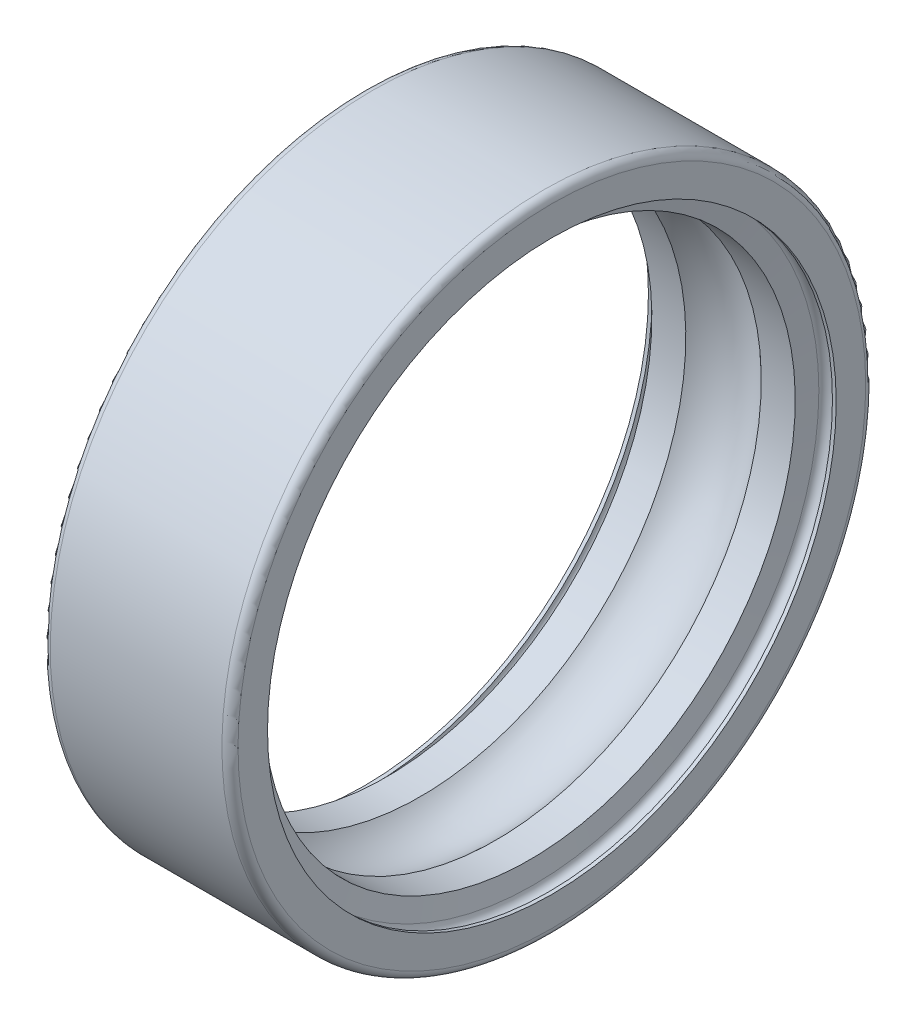
ISO-10303-21;
HEADER;
FILE_DESCRIPTION(('STEP AP214'),'2;1');
FILE_NAME('part.step','',(''),(''),'','','');
FILE_SCHEMA(('AUTOMOTIVE_DESIGN { 1 0 10303 214 1 1 1 1 }'));
ENDSEC;
DATA;
#1=APPLICATION_CONTEXT('core data for automotive mechanical design processes');
#2=APPLICATION_PROTOCOL_DEFINITION('international standard','automotive_design',2000,#1);
#3=PRODUCT_CONTEXT('',#1,'mechanical');
#4=PRODUCT('Part','Part','',(#3));
#5=PRODUCT_RELATED_PRODUCT_CATEGORY('part','',(#4));
#6=PRODUCT_DEFINITION_FORMATION('','',#4);
#7=PRODUCT_DEFINITION_CONTEXT('part definition',#1,'design');
#8=PRODUCT_DEFINITION('design','',#6,#7);
#9=PRODUCT_DEFINITION_SHAPE('','',#8);
#10=(LENGTH_UNIT() NAMED_UNIT(*) SI_UNIT(.MILLI.,.METRE.));
#11=(NAMED_UNIT(*) PLANE_ANGLE_UNIT() SI_UNIT($,.RADIAN.));
#12=(NAMED_UNIT(*) SI_UNIT($,.STERADIAN.) SOLID_ANGLE_UNIT());
#13=UNCERTAINTY_MEASURE_WITH_UNIT(LENGTH_MEASURE(1.E-05),#10,'distance_accuracy_value','');
#14=(GEOMETRIC_REPRESENTATION_CONTEXT(3) GLOBAL_UNCERTAINTY_ASSIGNED_CONTEXT((#13)) GLOBAL_UNIT_ASSIGNED_CONTEXT((#10,
#11,#12)) REPRESENTATION_CONTEXT('',''));
#15=CARTESIAN_POINT('',(0.,0.,0.));
#16=DIRECTION('',(0.,0.,1.));
#17=DIRECTION('',(1.,0.,0.));
#18=AXIS2_PLACEMENT_3D('',#15,#16,#17);
#19=CARTESIAN_POINT('',(6.58,0.,0.));
#20=DIRECTION('',(1.,0.,0.));
#21=DIRECTION('',(0.,0.,-1.));
#22=AXIS2_PLACEMENT_3D('',#19,#20,#21);
#23=TOROIDAL_SURFACE('',#22,10.6,0.28);
#24=CARTESIAN_POINT('',(6.86,0.,0.));
#25=DIRECTION('',(1.,0.,0.));
#26=DIRECTION('',(0.,1.,0.));
#27=AXIS2_PLACEMENT_3D('',#24,#25,#26);
#28=CIRCLE('',#27,10.6);
#29=CARTESIAN_POINT('',(6.86,10.6,0.));
#30=VERTEX_POINT('',#29);
#31=EDGE_CURVE('E11',#30,#30,#28,.T.);
#32=ORIENTED_EDGE('',*,*,#31,.T.);
#33=EDGE_LOOP('',(#32));
#34=FACE_BOUND('',#33,.T.);
#35=CARTESIAN_POINT('',(6.30425382915658,0.,0.));
#36=DIRECTION('',(1.,0.,0.));
#37=DIRECTION('',(0.,1.,0.));
#38=AXIS2_PLACEMENT_3D('',#35,#36,#37);
#39=CIRCLE('',#38,10.6486214897467);
#40=CARTESIAN_POINT('',(6.30425382915658,10.6486214897467,0.));
#41=VERTEX_POINT('',#40);
#42=EDGE_CURVE('E83',#41,#41,#39,.T.);
#43=ORIENTED_EDGE('',*,*,#42,.F.);
#44=EDGE_LOOP('',(#43));
#45=FACE_BOUND('',#44,.T.);
#46=ADVANCED_FACE('F16',(#34,#45),#23,.F.);
#47=CARTESIAN_POINT('',(6.93,0.,0.));
#48=DIRECTION('',(-1.,0.,0.));
#49=DIRECTION('',(0.,1.,0.));
#50=AXIS2_PLACEMENT_3D('',#47,#48,#49);
#51=CYLINDRICAL_SURFACE('',#50,10.6);
#52=CARTESIAN_POINT('',(7.,0.,0.));
#53=DIRECTION('',(1.,0.,0.));
#54=DIRECTION('',(0.,1.,0.));
#55=AXIS2_PLACEMENT_3D('',#52,#53,#54);
#56=CIRCLE('',#55,10.6);
#57=CARTESIAN_POINT('',(7.,10.6,0.));
#58=VERTEX_POINT('',#57);
#59=EDGE_CURVE('E26',#58,#58,#56,.T.);
#60=ORIENTED_EDGE('',*,*,#59,.T.);
#61=EDGE_LOOP('',(#60));
#62=FACE_BOUND('',#61,.T.);
#63=ORIENTED_EDGE('',*,*,#31,.F.);
#64=EDGE_LOOP('',(#63));
#65=FACE_BOUND('',#64,.T.);
#66=ADVANCED_FACE('F122',(#62,#65),#51,.F.);
#67=CARTESIAN_POINT('',(7.,11.15,0.));
#68=DIRECTION('',(1.,0.,0.));
#69=DIRECTION('',(0.,1.,0.));
#70=AXIS2_PLACEMENT_3D('',#67,#68,#69);
#71=PLANE('',#70);
#72=CARTESIAN_POINT('',(7.,0.,0.));
#73=DIRECTION('',(1.,0.,0.));
#74=DIRECTION('',(0.,1.,0.));
#75=AXIS2_PLACEMENT_3D('',#72,#73,#74);
#76=CIRCLE('',#75,11.7);
#77=CARTESIAN_POINT('',(7.,11.7,0.));
#78=VERTEX_POINT('',#77);
#79=EDGE_CURVE('E88',#78,#78,#76,.T.);
#80=ORIENTED_EDGE('',*,*,#79,.T.);
#81=EDGE_LOOP('',(#80));
#82=FACE_BOUND('',#81,.T.);
#83=ORIENTED_EDGE('',*,*,#59,.F.);
#84=EDGE_LOOP('',(#83));
#85=FACE_BOUND('',#84,.T.);
#86=ADVANCED_FACE('F126',(#82,#85),#71,.T.);
#87=CARTESIAN_POINT('',(6.7,0.,0.));
#88=DIRECTION('',(1.,0.,0.));
#89=DIRECTION('',(0.,0.,-1.));
#90=AXIS2_PLACEMENT_3D('',#87,#88,#89);
#91=TOROIDAL_SURFACE('',#90,11.7,0.3);
#92=CARTESIAN_POINT('',(6.7,0.,0.));
#93=DIRECTION('',(1.,0.,0.));
#94=DIRECTION('',(0.,1.,0.));
#95=AXIS2_PLACEMENT_3D('',#92,#93,#94);
#96=CIRCLE('',#95,12.);
#97=CARTESIAN_POINT('',(6.7,12.,0.));
#98=VERTEX_POINT('',#97);
#99=EDGE_CURVE('E86',#98,#98,#96,.T.);
#100=ORIENTED_EDGE('',*,*,#99,.T.);
#101=EDGE_LOOP('',(#100));
#102=FACE_BOUND('',#101,.T.);
#103=ORIENTED_EDGE('',*,*,#79,.F.);
#104=EDGE_LOOP('',(#103));
#105=FACE_BOUND('',#104,.T.);
#106=ADVANCED_FACE('F130',(#102,#105),#91,.T.);
#107=CARTESIAN_POINT('',(3.5,0.,0.));
#108=DIRECTION('',(-1.,0.,0.));
#109=DIRECTION('',(0.,1.,0.));
#110=AXIS2_PLACEMENT_3D('',#107,#108,#109);
#111=CYLINDRICAL_SURFACE('',#110,12.);
#112=CARTESIAN_POINT('',(0.3,0.,0.));
#113=DIRECTION('',(1.,0.,0.));
#114=DIRECTION('',(0.,1.,0.));
#115=AXIS2_PLACEMENT_3D('',#112,#113,#114);
#116=CIRCLE('',#115,12.);
#117=CARTESIAN_POINT('',(0.3,12.,0.));
#118=VERTEX_POINT('',#117);
#119=EDGE_CURVE('E84',#118,#118,#116,.T.);
#120=ORIENTED_EDGE('',*,*,#119,.T.);
#121=EDGE_LOOP('',(#120));
#122=FACE_BOUND('',#121,.T.);
#123=ORIENTED_EDGE('',*,*,#99,.F.);
#124=EDGE_LOOP('',(#123));
#125=FACE_BOUND('',#124,.T.);
#126=ADVANCED_FACE('F132',(#122,#125),#111,.T.);
#127=CARTESIAN_POINT('',(0.3,0.,0.));
#128=DIRECTION('',(1.,0.,0.));
#129=DIRECTION('',(0.,0.,-1.));
#130=AXIS2_PLACEMENT_3D('',#127,#128,#129);
#131=TOROIDAL_SURFACE('',#130,11.7,0.3);
#132=CARTESIAN_POINT('',(0.,0.,0.));
#133=DIRECTION('',(1.,0.,0.));
#134=DIRECTION('',(0.,1.,0.));
#135=AXIS2_PLACEMENT_3D('',#132,#133,#134);
#136=CIRCLE('',#135,11.7);
#137=CARTESIAN_POINT('',(0.,11.7,0.));
#138=VERTEX_POINT('',#137);
#139=EDGE_CURVE('E87',#138,#138,#136,.T.);
#140=ORIENTED_EDGE('',*,*,#139,.T.);
#141=EDGE_LOOP('',(#140));
#142=FACE_BOUND('',#141,.T.);
#143=ORIENTED_EDGE('',*,*,#119,.F.);
#144=EDGE_LOOP('',(#143));
#145=FACE_BOUND('',#144,.T.);
#146=ADVANCED_FACE('F157',(#142,#145),#131,.T.);
#147=CARTESIAN_POINT('',(0.,11.15,0.));
#148=DIRECTION('',(-1.,0.,0.));
#149=DIRECTION('',(0.,-1.,0.));
#150=AXIS2_PLACEMENT_3D('',#147,#148,#149);
#151=PLANE('',#150);
#152=CARTESIAN_POINT('',(0.,0.,0.));
#153=DIRECTION('',(1.,0.,0.));
#154=DIRECTION('',(0.,1.,0.));
#155=AXIS2_PLACEMENT_3D('',#152,#153,#154);
#156=CIRCLE('',#155,10.6);
#157=CARTESIAN_POINT('',(0.,10.6,0.));
#158=VERTEX_POINT('',#157);
#159=EDGE_CURVE('E89',#158,#158,#156,.T.);
#160=ORIENTED_EDGE('',*,*,#159,.T.);
#161=EDGE_LOOP('',(#160));
#162=FACE_BOUND('',#161,.T.);
#163=ORIENTED_EDGE('',*,*,#139,.F.);
#164=EDGE_LOOP('',(#163));
#165=FACE_BOUND('',#164,.T.);
#166=ADVANCED_FACE('F149',(#162,#165),#151,.T.);
#167=CARTESIAN_POINT('',(0.07,0.,0.));
#168=DIRECTION('',(-1.,0.,0.));
#169=DIRECTION('',(0.,1.,0.));
#170=AXIS2_PLACEMENT_3D('',#167,#168,#169);
#171=CYLINDRICAL_SURFACE('',#170,10.6);
#172=CARTESIAN_POINT('',(0.14,0.,0.));
#173=DIRECTION('',(1.,0.,0.));
#174=DIRECTION('',(0.,1.,0.));
#175=AXIS2_PLACEMENT_3D('',#172,#173,#174);
#176=CIRCLE('',#175,10.6);
#177=CARTESIAN_POINT('',(0.14,10.6,0.));
#178=VERTEX_POINT('',#177);
#179=EDGE_CURVE('E75',#178,#178,#176,.T.);
#180=ORIENTED_EDGE('',*,*,#179,.T.);
#181=EDGE_LOOP('',(#180));
#182=FACE_BOUND('',#181,.T.);
#183=ORIENTED_EDGE('',*,*,#159,.F.);
#184=EDGE_LOOP('',(#183));
#185=FACE_BOUND('',#184,.T.);
#186=ADVANCED_FACE('F144',(#182,#185),#171,.F.);
#187=CARTESIAN_POINT('',(0.42,0.,0.));
#188=DIRECTION('',(1.,0.,0.));
#189=DIRECTION('',(0.,0.,-1.));
#190=AXIS2_PLACEMENT_3D('',#187,#188,#189);
#191=TOROIDAL_SURFACE('',#190,10.6,0.28);
#192=CARTESIAN_POINT('',(0.695746170843417,0.,0.));
#193=DIRECTION('',(1.,0.,0.));
#194=DIRECTION('',(0.,1.,0.));
#195=AXIS2_PLACEMENT_3D('',#192,#193,#194);
#196=CIRCLE('',#195,10.6486214897467);
#197=CARTESIAN_POINT('',(0.695746170843417,10.6486214897467,0.));
#198=VERTEX_POINT('',#197);
#199=EDGE_CURVE('E66',#198,#198,#196,.T.);
#200=ORIENTED_EDGE('',*,*,#199,.T.);
#201=EDGE_LOOP('',(#200));
#202=FACE_BOUND('',#201,.T.);
#203=ORIENTED_EDGE('',*,*,#179,.F.);
#204=EDGE_LOOP('',(#203));
#205=FACE_BOUND('',#204,.T.);
#206=ADVANCED_FACE('F139',(#202,#205),#191,.F.);
#207=CARTESIAN_POINT('',(0.761747254333675,0.,0.));
#208=DIRECTION('',(-1.,0.,0.));
#209=DIRECTION('',(0.,1.,0.));
#210=AXIS2_PLACEMENT_3D('',#207,#208,#209);
#211=CONICAL_SURFACE('',#210,10.2743107448734,1.39626340159546);
#212=CARTESIAN_POINT('',(0.827748337823933,0.,0.));
#213=DIRECTION('',(1.,0.,0.));
#214=DIRECTION('',(0.,1.,0.));
#215=AXIS2_PLACEMENT_3D('',#212,#213,#214);
#216=CIRCLE('',#215,9.9);
#217=CARTESIAN_POINT('',(0.827748337823933,9.9,0.));
#218=VERTEX_POINT('',#217);
#219=EDGE_CURVE('E71',#218,#218,#216,.T.);
#220=ORIENTED_EDGE('',*,*,#219,.T.);
#221=EDGE_LOOP('',(#220));
#222=FACE_BOUND('',#221,.T.);
#223=ORIENTED_EDGE('',*,*,#199,.F.);
#224=EDGE_LOOP('',(#223));
#225=FACE_BOUND('',#224,.T.);
#226=ADVANCED_FACE('F18',(#222,#225),#211,.F.);
#227=CARTESIAN_POINT('',(1.46062452440441,0.,0.));
#228=DIRECTION('',(-1.,0.,0.));
#229=DIRECTION('',(0.,1.,0.));
#230=AXIS2_PLACEMENT_3D('',#227,#228,#229);
#231=CYLINDRICAL_SURFACE('',#230,9.9);
#232=CARTESIAN_POINT('',(2.0935007109849,0.,0.));
#233=DIRECTION('',(1.,0.,0.));
#234=DIRECTION('',(0.,1.,0.));
#235=AXIS2_PLACEMENT_3D('',#232,#233,#234);
#236=CIRCLE('',#235,9.9);
#237=CARTESIAN_POINT('',(2.0935007109849,9.9,0.));
#238=VERTEX_POINT('',#237);
#239=EDGE_CURVE('E20',#238,#238,#236,.T.);
#240=ORIENTED_EDGE('',*,*,#239,.T.);
#241=EDGE_LOOP('',(#240));
#242=FACE_BOUND('',#241,.T.);
#243=ORIENTED_EDGE('',*,*,#219,.F.);
#244=EDGE_LOOP('',(#243));
#245=FACE_BOUND('',#244,.T.);
#246=ADVANCED_FACE('F117',(#242,#245),#231,.F.);
#247=CARTESIAN_POINT('',(3.5,0.,0.));
#248=DIRECTION('',(1.,0.,0.));
#249=DIRECTION('',(0.,0.,-1.));
#250=AXIS2_PLACEMENT_3D('',#247,#248,#249);
#251=TOROIDAL_SURFACE('',#250,8.5,1.9845);
#252=CARTESIAN_POINT('',(4.9064992890151,0.,0.));
#253=DIRECTION('',(1.,0.,0.));
#254=DIRECTION('',(0.,1.,0.));
#255=AXIS2_PLACEMENT_3D('',#252,#253,#254);
#256=CIRCLE('',#255,9.9);
#257=CARTESIAN_POINT('',(4.9064992890151,9.9,0.));
#258=VERTEX_POINT('',#257);
#259=EDGE_CURVE('E77',#258,#258,#256,.T.);
#260=ORIENTED_EDGE('',*,*,#259,.T.);
#261=EDGE_LOOP('',(#260));
#262=FACE_BOUND('',#261,.T.);
#263=ORIENTED_EDGE('',*,*,#239,.F.);
#264=EDGE_LOOP('',(#263));
#265=FACE_BOUND('',#264,.T.);
#266=ADVANCED_FACE('F103',(#262,#265),#251,.F.);
#267=CARTESIAN_POINT('',(5.53937547559558,0.,0.));
#268=DIRECTION('',(-1.,0.,0.));
#269=DIRECTION('',(0.,1.,0.));
#270=AXIS2_PLACEMENT_3D('',#267,#268,#269);
#271=CYLINDRICAL_SURFACE('',#270,9.9);
#272=CARTESIAN_POINT('',(6.17225166217606,0.,0.));
#273=DIRECTION('',(1.,0.,0.));
#274=DIRECTION('',(0.,1.,0.));
#275=AXIS2_PLACEMENT_3D('',#272,#273,#274);
#276=CIRCLE('',#275,9.9);
#277=CARTESIAN_POINT('',(6.17225166217606,9.9,0.));
#278=VERTEX_POINT('',#277);
#279=EDGE_CURVE('E81',#278,#278,#276,.T.);
#280=ORIENTED_EDGE('',*,*,#279,.T.);
#281=EDGE_LOOP('',(#280));
#282=FACE_BOUND('',#281,.T.);
#283=ORIENTED_EDGE('',*,*,#259,.F.);
#284=EDGE_LOOP('',(#283));
#285=FACE_BOUND('',#284,.T.);
#286=ADVANCED_FACE('F106',(#282,#285),#271,.F.);
#287=CARTESIAN_POINT('',(6.23825274566632,0.,0.));
#288=DIRECTION('',(1.,0.,0.));
#289=DIRECTION('',(0.,1.,0.));
#290=AXIS2_PLACEMENT_3D('',#287,#288,#289);
#291=CONICAL_SURFACE('',#290,10.2743107448734,1.39626340159546);
#292=ORIENTED_EDGE('',*,*,#42,.T.);
#293=EDGE_LOOP('',(#292));
#294=FACE_BOUND('',#293,.T.);
#295=ORIENTED_EDGE('',*,*,#279,.F.);
#296=EDGE_LOOP('',(#295));
#297=FACE_BOUND('',#296,.T.);
#298=ADVANCED_FACE('F108',(#294,#297),#291,.F.);
#299=CLOSED_SHELL('',(#46,#66,#86,#106,#126,#146,#166,#186,#206,#226,#246,#266,#286,#298));
#300=MANIFOLD_SOLID_BREP('B1',#299);
#301=ADVANCED_BREP_SHAPE_REPRESENTATION('',(#18,#300),#14);
#302=SHAPE_DEFINITION_REPRESENTATION(#9,#301);
ENDSEC;
END-ISO-10303-21;
